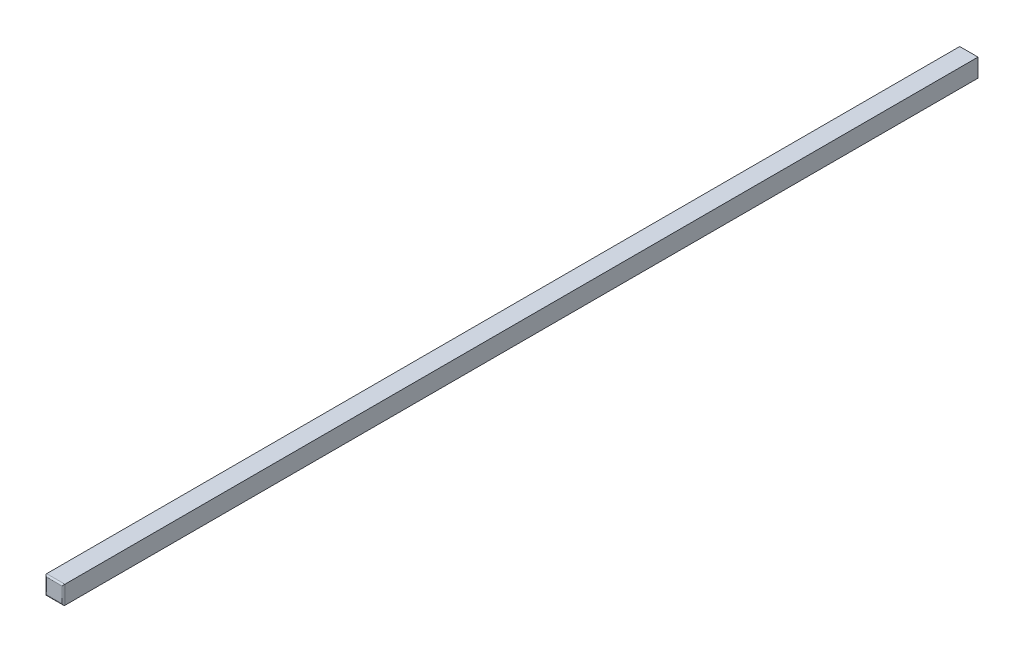
ISO-10303-21;
HEADER;
FILE_DESCRIPTION(('STEP AP214'),'2;1');
FILE_NAME('part.step','',(''),(''),'','','');
FILE_SCHEMA(('AUTOMOTIVE_DESIGN { 1 0 10303 214 1 1 1 1 }'));
ENDSEC;
DATA;
#1=APPLICATION_CONTEXT('core data for automotive mechanical design processes');
#2=APPLICATION_PROTOCOL_DEFINITION('international standard','automotive_design',2000,#1);
#3=PRODUCT_CONTEXT('',#1,'mechanical');
#4=PRODUCT('Part','Part','',(#3));
#5=PRODUCT_RELATED_PRODUCT_CATEGORY('part','',(#4));
#6=PRODUCT_DEFINITION_FORMATION('','',#4);
#7=PRODUCT_DEFINITION_CONTEXT('part definition',#1,'design');
#8=PRODUCT_DEFINITION('design','',#6,#7);
#9=PRODUCT_DEFINITION_SHAPE('','',#8);
#10=(LENGTH_UNIT() NAMED_UNIT(*) SI_UNIT(.MILLI.,.METRE.));
#11=(NAMED_UNIT(*) PLANE_ANGLE_UNIT() SI_UNIT($,.RADIAN.));
#12=(NAMED_UNIT(*) SI_UNIT($,.STERADIAN.) SOLID_ANGLE_UNIT());
#13=UNCERTAINTY_MEASURE_WITH_UNIT(LENGTH_MEASURE(1.E-05),#10,'distance_accuracy_value','');
#14=(GEOMETRIC_REPRESENTATION_CONTEXT(3) GLOBAL_UNCERTAINTY_ASSIGNED_CONTEXT((#13)) GLOBAL_UNIT_ASSIGNED_CONTEXT((#10,
#11,#12)) REPRESENTATION_CONTEXT('',''));
#15=CARTESIAN_POINT('',(0.,0.,0.));
#16=DIRECTION('',(0.,0.,1.));
#17=DIRECTION('',(1.,0.,0.));
#18=AXIS2_PLACEMENT_3D('',#15,#16,#17);
#19=CARTESIAN_POINT('',(-3.,-3.,150.));
#20=DIRECTION('',(1.,0.,0.));
#21=DIRECTION('',(0.,1.,0.));
#22=AXIS2_PLACEMENT_3D('',#19,#20,#21);
#23=PLANE('',#22);
#24=DIRECTION('',(0.,0.,-1.));
#25=VECTOR('',#24,1.);
#26=CARTESIAN_POINT('',(-3.,-3.,150.));
#27=LINE('',#26,#25);
#28=CARTESIAN_POINT('',(-3.,-3.,149.5));
#29=VERTEX_POINT('',#28);
#30=CARTESIAN_POINT('',(-3.,-3.,-150.));
#31=VERTEX_POINT('',#30);
#32=EDGE_CURVE('E92',#29,#31,#27,.T.);
#33=ORIENTED_EDGE('',*,*,#32,.F.);
#34=DIRECTION('',(0.,-1.,0.));
#35=VECTOR('',#34,1.);
#36=CARTESIAN_POINT('',(-3.,-3.,149.5));
#37=LINE('',#36,#35);
#38=CARTESIAN_POINT('',(-3.,3.,149.5));
#39=VERTEX_POINT('',#38);
#40=EDGE_CURVE('E136',#29,#39,#37,.F.);
#41=ORIENTED_EDGE('',*,*,#40,.T.);
#42=DIRECTION('',(0.,0.,-1.));
#43=VECTOR('',#42,1.);
#44=CARTESIAN_POINT('',(-3.,3.,150.));
#45=LINE('',#44,#43);
#46=CARTESIAN_POINT('',(-3.,3.,-150.));
#47=VERTEX_POINT('',#46);
#48=EDGE_CURVE('E112',#39,#47,#45,.T.);
#49=ORIENTED_EDGE('',*,*,#48,.T.);
#50=DIRECTION('',(0.,-1.,0.));
#51=VECTOR('',#50,1.);
#52=CARTESIAN_POINT('',(-3.,-3.,-150.));
#53=LINE('',#52,#51);
#54=EDGE_CURVE('E107',#47,#31,#53,.T.);
#55=ORIENTED_EDGE('',*,*,#54,.T.);
#56=EDGE_LOOP('',(#33,#41,#49,#55));
#57=FACE_BOUND('',#56,.T.);
#58=ADVANCED_FACE('F41',(#57),#23,.F.);
#59=CARTESIAN_POINT('',(3.,-3.,150.));
#60=DIRECTION('',(0.,1.,0.));
#61=DIRECTION('',(-1.,0.,0.));
#62=AXIS2_PLACEMENT_3D('',#59,#60,#61);
#63=PLANE('',#62);
#64=DIRECTION('',(0.,0.,-1.));
#65=VECTOR('',#64,1.);
#66=CARTESIAN_POINT('',(3.,-3.,150.));
#67=LINE('',#66,#65);
#68=CARTESIAN_POINT('',(3.,-3.,149.5));
#69=VERTEX_POINT('',#68);
#70=CARTESIAN_POINT('',(3.,-3.,-150.));
#71=VERTEX_POINT('',#70);
#72=EDGE_CURVE('E101',#69,#71,#67,.T.);
#73=ORIENTED_EDGE('',*,*,#72,.F.);
#74=DIRECTION('',(1.,0.,0.));
#75=VECTOR('',#74,1.);
#76=CARTESIAN_POINT('',(3.,-3.,149.5));
#77=LINE('',#76,#75);
#78=EDGE_CURVE('E11',#69,#29,#77,.F.);
#79=ORIENTED_EDGE('',*,*,#78,.T.);
#80=ORIENTED_EDGE('',*,*,#32,.T.);
#81=DIRECTION('',(1.,0.,0.));
#82=VECTOR('',#81,1.);
#83=CARTESIAN_POINT('',(3.,-3.,-150.));
#84=LINE('',#83,#82);
#85=EDGE_CURVE('E95',#31,#71,#84,.T.);
#86=ORIENTED_EDGE('',*,*,#85,.T.);
#87=EDGE_LOOP('',(#73,#79,#80,#86));
#88=FACE_BOUND('',#87,.T.);
#89=ADVANCED_FACE('F94',(#88),#63,.F.);
#90=CARTESIAN_POINT('',(3.,3.,150.));
#91=DIRECTION('',(-1.,0.,0.));
#92=DIRECTION('',(0.,-1.,0.));
#93=AXIS2_PLACEMENT_3D('',#90,#91,#92);
#94=PLANE('',#93);
#95=DIRECTION('',(0.,0.,-1.));
#96=VECTOR('',#95,1.);
#97=CARTESIAN_POINT('',(3.,3.,150.));
#98=LINE('',#97,#96);
#99=CARTESIAN_POINT('',(3.,3.,149.5));
#100=VERTEX_POINT('',#99);
#101=CARTESIAN_POINT('',(3.,3.,-150.));
#102=VERTEX_POINT('',#101);
#103=EDGE_CURVE('E122',#100,#102,#98,.T.);
#104=ORIENTED_EDGE('',*,*,#103,.F.);
#105=DIRECTION('',(0.,1.,0.));
#106=VECTOR('',#105,1.);
#107=CARTESIAN_POINT('',(3.,3.,149.5));
#108=LINE('',#107,#106);
#109=EDGE_CURVE('E50',#100,#69,#108,.F.);
#110=ORIENTED_EDGE('',*,*,#109,.T.);
#111=ORIENTED_EDGE('',*,*,#72,.T.);
#112=DIRECTION('',(0.,1.,0.));
#113=VECTOR('',#112,1.);
#114=CARTESIAN_POINT('',(3.,3.,-150.));
#115=LINE('',#114,#113);
#116=EDGE_CURVE('E109',#71,#102,#115,.T.);
#117=ORIENTED_EDGE('',*,*,#116,.T.);
#118=EDGE_LOOP('',(#104,#110,#111,#117));
#119=FACE_BOUND('',#118,.T.);
#120=ADVANCED_FACE('F161',(#119),#94,.F.);
#121=CARTESIAN_POINT('',(-3.,3.,150.));
#122=DIRECTION('',(0.,-1.,0.));
#123=DIRECTION('',(1.,0.,0.));
#124=AXIS2_PLACEMENT_3D('',#121,#122,#123);
#125=PLANE('',#124);
#126=ORIENTED_EDGE('',*,*,#48,.F.);
#127=DIRECTION('',(-1.,0.,0.));
#128=VECTOR('',#127,1.);
#129=CARTESIAN_POINT('',(-3.,3.,149.5));
#130=LINE('',#129,#128);
#131=EDGE_CURVE('E133',#39,#100,#130,.F.);
#132=ORIENTED_EDGE('',*,*,#131,.T.);
#133=ORIENTED_EDGE('',*,*,#103,.T.);
#134=DIRECTION('',(-1.,0.,0.));
#135=VECTOR('',#134,1.);
#136=CARTESIAN_POINT('',(-3.,3.,-150.));
#137=LINE('',#136,#135);
#138=EDGE_CURVE('E119',#102,#47,#137,.T.);
#139=ORIENTED_EDGE('',*,*,#138,.T.);
#140=EDGE_LOOP('',(#126,#132,#133,#139));
#141=FACE_BOUND('',#140,.T.);
#142=ADVANCED_FACE('F160',(#141),#125,.F.);
#143=CARTESIAN_POINT('',(0.,0.,150.));
#144=DIRECTION('',(0.,0.,-1.));
#145=DIRECTION('',(-1.,0.,0.));
#146=AXIS2_PLACEMENT_3D('',#143,#144,#145);
#147=PLANE('',#146);
#148=DIRECTION('',(0.,1.,0.));
#149=VECTOR('',#148,1.);
#150=CARTESIAN_POINT('',(2.5,0.,150.));
#151=LINE('',#150,#149);
#152=CARTESIAN_POINT('',(2.5,-2.5,150.));
#153=VERTEX_POINT('',#152);
#154=CARTESIAN_POINT('',(2.5,2.5,150.));
#155=VERTEX_POINT('',#154);
#156=EDGE_CURVE('E126',#153,#155,#151,.T.);
#157=ORIENTED_EDGE('',*,*,#156,.T.);
#158=DIRECTION('',(-1.,0.,0.));
#159=VECTOR('',#158,1.);
#160=CARTESIAN_POINT('',(0.,2.5,150.));
#161=LINE('',#160,#159);
#162=CARTESIAN_POINT('',(-2.5,2.5,150.));
#163=VERTEX_POINT('',#162);
#164=EDGE_CURVE('E130',#155,#163,#161,.T.);
#165=ORIENTED_EDGE('',*,*,#164,.T.);
#166=DIRECTION('',(0.,-1.,0.));
#167=VECTOR('',#166,1.);
#168=CARTESIAN_POINT('',(-2.5,0.,150.));
#169=LINE('',#168,#167);
#170=CARTESIAN_POINT('',(-2.5,-2.5,150.));
#171=VERTEX_POINT('',#170);
#172=EDGE_CURVE('E128',#163,#171,#169,.T.);
#173=ORIENTED_EDGE('',*,*,#172,.T.);
#174=DIRECTION('',(1.,0.,0.));
#175=VECTOR('',#174,1.);
#176=CARTESIAN_POINT('',(0.,-2.5,150.));
#177=LINE('',#176,#175);
#178=EDGE_CURVE('E100',#171,#153,#177,.T.);
#179=ORIENTED_EDGE('',*,*,#178,.T.);
#180=EDGE_LOOP('',(#157,#165,#173,#179));
#181=FACE_BOUND('',#180,.T.);
#182=ADVANCED_FACE('F153',(#181),#147,.F.);
#183=CARTESIAN_POINT('',(0.,0.,-150.));
#184=DIRECTION('',(0.,0.,-1.));
#185=DIRECTION('',(-1.,0.,0.));
#186=AXIS2_PLACEMENT_3D('',#183,#184,#185);
#187=PLANE('',#186);
#188=ORIENTED_EDGE('',*,*,#54,.F.);
#189=ORIENTED_EDGE('',*,*,#138,.F.);
#190=ORIENTED_EDGE('',*,*,#116,.F.);
#191=ORIENTED_EDGE('',*,*,#85,.F.);
#192=EDGE_LOOP('',(#188,#189,#190,#191));
#193=FACE_BOUND('',#192,.T.);
#194=ADVANCED_FACE('F105',(#193),#187,.T.);
#195=CARTESIAN_POINT('',(0.,-2.5,149.5));
#196=DIRECTION('',(1.,0.,0.));
#197=DIRECTION('',(0.,1.,0.));
#198=AXIS2_PLACEMENT_3D('',#195,#196,#197);
#199=CYLINDRICAL_SURFACE('',#198,0.5);
#200=CARTESIAN_POINT('',(-2.5,-2.5,149.5));
#201=DIRECTION('',(0.707106781186548,-0.707106781186547,0.));
#202=DIRECTION('',(0.707106781186547,0.707106781186548,0.));
#203=AXIS2_PLACEMENT_3D('',#200,#201,#202);
#204=ELLIPSE('',#203,0.707106781186547,0.5);
#205=EDGE_CURVE('E116',#29,#171,#204,.F.);
#206=ORIENTED_EDGE('',*,*,#205,.F.);
#207=ORIENTED_EDGE('',*,*,#78,.F.);
#208=CARTESIAN_POINT('',(2.5,-2.5,149.5));
#209=DIRECTION('',(0.707106781186547,0.707106781186548,0.));
#210=DIRECTION('',(0.707106781186548,-0.707106781186547,0.));
#211=AXIS2_PLACEMENT_3D('',#208,#209,#210);
#212=ELLIPSE('',#211,0.707106781186547,0.5);
#213=EDGE_CURVE('E45',#153,#69,#212,.T.);
#214=ORIENTED_EDGE('',*,*,#213,.F.);
#215=ORIENTED_EDGE('',*,*,#178,.F.);
#216=EDGE_LOOP('',(#206,#207,#214,#215));
#217=FACE_BOUND('',#216,.T.);
#218=ADVANCED_FACE('F43',(#217),#199,.T.);
#219=CARTESIAN_POINT('',(2.5,0.,149.5));
#220=DIRECTION('',(0.,1.,0.));
#221=DIRECTION('',(-1.,0.,0.));
#222=AXIS2_PLACEMENT_3D('',#219,#220,#221);
#223=CYLINDRICAL_SURFACE('',#222,0.5);
#224=ORIENTED_EDGE('',*,*,#213,.T.);
#225=ORIENTED_EDGE('',*,*,#109,.F.);
#226=CARTESIAN_POINT('',(2.5,2.5,149.5));
#227=DIRECTION('',(-0.707106781186548,0.707106781186547,0.));
#228=DIRECTION('',(0.707106781186547,0.707106781186548,0.));
#229=AXIS2_PLACEMENT_3D('',#226,#227,#228);
#230=ELLIPSE('',#229,0.707106781186548,0.5);
#231=EDGE_CURVE('E141',#155,#100,#230,.T.);
#232=ORIENTED_EDGE('',*,*,#231,.F.);
#233=ORIENTED_EDGE('',*,*,#156,.F.);
#234=EDGE_LOOP('',(#224,#225,#232,#233));
#235=FACE_BOUND('',#234,.T.);
#236=ADVANCED_FACE('F179',(#235),#223,.T.);
#237=CARTESIAN_POINT('',(-2.5,0.,149.5));
#238=DIRECTION('',(0.,-1.,0.));
#239=DIRECTION('',(1.,0.,0.));
#240=AXIS2_PLACEMENT_3D('',#237,#238,#239);
#241=CYLINDRICAL_SURFACE('',#240,0.5);
#242=ORIENTED_EDGE('',*,*,#205,.T.);
#243=ORIENTED_EDGE('',*,*,#172,.F.);
#244=CARTESIAN_POINT('',(-2.5,2.5,149.5));
#245=DIRECTION('',(-0.707106781186547,-0.707106781186548,0.));
#246=DIRECTION('',(0.707106781186548,-0.707106781186547,0.));
#247=AXIS2_PLACEMENT_3D('',#244,#245,#246);
#248=ELLIPSE('',#247,0.707106781186547,0.5);
#249=EDGE_CURVE('E139',#39,#163,#248,.F.);
#250=ORIENTED_EDGE('',*,*,#249,.F.);
#251=ORIENTED_EDGE('',*,*,#40,.F.);
#252=EDGE_LOOP('',(#242,#243,#250,#251));
#253=FACE_BOUND('',#252,.T.);
#254=ADVANCED_FACE('F146',(#253),#241,.T.);
#255=CARTESIAN_POINT('',(0.,2.5,149.5));
#256=DIRECTION('',(-1.,0.,0.));
#257=DIRECTION('',(0.,-1.,0.));
#258=AXIS2_PLACEMENT_3D('',#255,#256,#257);
#259=CYLINDRICAL_SURFACE('',#258,0.5);
#260=ORIENTED_EDGE('',*,*,#231,.T.);
#261=ORIENTED_EDGE('',*,*,#131,.F.);
#262=ORIENTED_EDGE('',*,*,#249,.T.);
#263=ORIENTED_EDGE('',*,*,#164,.F.);
#264=EDGE_LOOP('',(#260,#261,#262,#263));
#265=FACE_BOUND('',#264,.T.);
#266=ADVANCED_FACE('F157',(#265),#259,.T.);
#267=CLOSED_SHELL('',(#58,#89,#120,#142,#182,#194,#218,#236,#254,#266));
#268=MANIFOLD_SOLID_BREP('B2',#267);
#269=ADVANCED_BREP_SHAPE_REPRESENTATION('',(#18,#268),#14);
#270=SHAPE_DEFINITION_REPRESENTATION(#9,#269);
ENDSEC;
END-ISO-10303-21;
